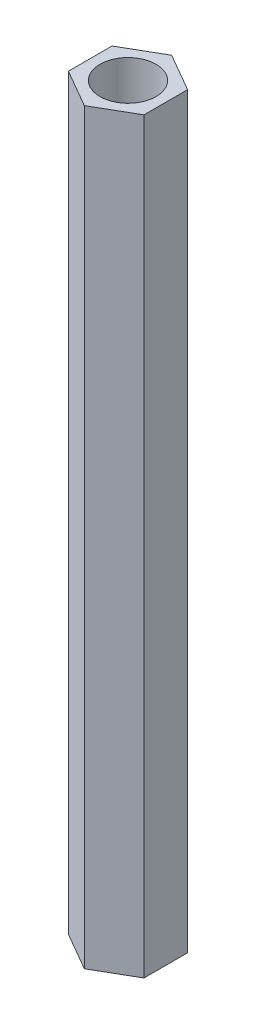
ISO-10303-21;
HEADER;
FILE_DESCRIPTION(('STEP AP214'),'2;1');
FILE_NAME('part.step','',(''),(''),'','','');
FILE_SCHEMA(('AUTOMOTIVE_DESIGN { 1 0 10303 214 1 1 1 1 }'));
ENDSEC;
DATA;
#1=APPLICATION_CONTEXT('core data for automotive mechanical design processes');
#2=APPLICATION_PROTOCOL_DEFINITION('international standard','automotive_design',2000,#1);
#3=PRODUCT_CONTEXT('',#1,'mechanical');
#4=PRODUCT('Part','Part','',(#3));
#5=PRODUCT_RELATED_PRODUCT_CATEGORY('part','',(#4));
#6=PRODUCT_DEFINITION_FORMATION('','',#4);
#7=PRODUCT_DEFINITION_CONTEXT('part definition',#1,'design');
#8=PRODUCT_DEFINITION('design','',#6,#7);
#9=PRODUCT_DEFINITION_SHAPE('','',#8);
#10=(LENGTH_UNIT() NAMED_UNIT(*) SI_UNIT(.MILLI.,.METRE.));
#11=(NAMED_UNIT(*) PLANE_ANGLE_UNIT() SI_UNIT($,.RADIAN.));
#12=(NAMED_UNIT(*) SI_UNIT($,.STERADIAN.) SOLID_ANGLE_UNIT());
#13=UNCERTAINTY_MEASURE_WITH_UNIT(LENGTH_MEASURE(1.E-05),#10,'distance_accuracy_value','');
#14=(GEOMETRIC_REPRESENTATION_CONTEXT(3) GLOBAL_UNCERTAINTY_ASSIGNED_CONTEXT((#13)) GLOBAL_UNIT_ASSIGNED_CONTEXT((#10,
#11,#12)) REPRESENTATION_CONTEXT('',''));
#15=CARTESIAN_POINT('',(0.,0.,0.));
#16=DIRECTION('',(0.,0.,1.));
#17=DIRECTION('',(1.,0.,0.));
#18=AXIS2_PLACEMENT_3D('',#15,#16,#17);
#19=CARTESIAN_POINT('',(0.,40.,0.));
#20=DIRECTION('',(0.,1.,0.));
#21=DIRECTION('',(0.,0.,1.));
#22=AXIS2_PLACEMENT_3D('',#19,#20,#21);
#23=PLANE('',#22);
#24=DIRECTION('',(0.,0.,-1.));
#25=VECTOR('',#24,1.);
#26=CARTESIAN_POINT('',(2.02216931783666,40.,1.1675));
#27=LINE('',#26,#25);
#28=CARTESIAN_POINT('',(2.02216931783666,40.,1.1675));
#29=VERTEX_POINT('',#28);
#30=CARTESIAN_POINT('',(2.02216931783666,40.,-1.1675));
#31=VERTEX_POINT('',#30);
#32=EDGE_CURVE('E137',#29,#31,#27,.T.);
#33=ORIENTED_EDGE('',*,*,#32,.T.);
#34=DIRECTION('',(-0.866025403784439,0.,-0.5));
#35=VECTOR('',#34,1.);
#36=CARTESIAN_POINT('',(2.02216931783666,40.,-1.1675));
#37=LINE('',#36,#35);
#38=CARTESIAN_POINT('',(0.,40.,-2.335));
#39=VERTEX_POINT('',#38);
#40=EDGE_CURVE('E95',#31,#39,#37,.T.);
#41=ORIENTED_EDGE('',*,*,#40,.T.);
#42=DIRECTION('',(-0.866025403784439,0.,0.5));
#43=VECTOR('',#42,1.);
#44=CARTESIAN_POINT('',(0.,40.,-2.335));
#45=LINE('',#44,#43);
#46=CARTESIAN_POINT('',(-2.02216931783666,40.,-1.1675));
#47=VERTEX_POINT('',#46);
#48=EDGE_CURVE('E108',#39,#47,#45,.T.);
#49=ORIENTED_EDGE('',*,*,#48,.T.);
#50=DIRECTION('',(0.,0.,1.));
#51=VECTOR('',#50,1.);
#52=CARTESIAN_POINT('',(-2.02216931783666,40.,-1.1675));
#53=LINE('',#52,#51);
#54=CARTESIAN_POINT('',(-2.02216931783666,40.,1.1675));
#55=VERTEX_POINT('',#54);
#56=EDGE_CURVE('E102',#47,#55,#53,.T.);
#57=ORIENTED_EDGE('',*,*,#56,.T.);
#58=DIRECTION('',(0.866025403784438,0.,0.5));
#59=VECTOR('',#58,1.);
#60=CARTESIAN_POINT('',(-2.02216931783666,40.,1.1675));
#61=LINE('',#60,#59);
#62=CARTESIAN_POINT('',(0.,40.,2.335));
#63=VERTEX_POINT('',#62);
#64=EDGE_CURVE('E106',#55,#63,#61,.T.);
#65=ORIENTED_EDGE('',*,*,#64,.T.);
#66=DIRECTION('',(0.866025403784439,0.,-0.5));
#67=VECTOR('',#66,1.);
#68=CARTESIAN_POINT('',(0.,40.,2.335));
#69=LINE('',#68,#67);
#70=EDGE_CURVE('E58',#63,#29,#69,.T.);
#71=ORIENTED_EDGE('',*,*,#70,.T.);
#72=EDGE_LOOP('',(#33,#41,#49,#57,#65,#71));
#73=FACE_BOUND('',#72,.T.);
#74=CARTESIAN_POINT('',(0.,40.,0.));
#75=DIRECTION('',(0.,1.,0.));
#76=DIRECTION('',(0.,0.,1.));
#77=AXIS2_PLACEMENT_3D('',#74,#75,#76);
#78=CIRCLE('',#77,1.5);
#79=CARTESIAN_POINT('',(0.,40.,1.5));
#80=VERTEX_POINT('',#79);
#81=EDGE_CURVE('E130',#80,#80,#78,.T.);
#82=ORIENTED_EDGE('',*,*,#81,.F.);
#83=EDGE_LOOP('',(#82));
#84=FACE_BOUND('',#83,.T.);
#85=ADVANCED_FACE('F41',(#73,#84),#23,.T.);
#86=CARTESIAN_POINT('',(0.,0.,0.));
#87=DIRECTION('',(0.,1.,0.));
#88=DIRECTION('',(0.,0.,1.));
#89=AXIS2_PLACEMENT_3D('',#86,#87,#88);
#90=PLANE('',#89);
#91=DIRECTION('',(0.,0.,-1.));
#92=VECTOR('',#91,1.);
#93=CARTESIAN_POINT('',(2.02216931783666,0.,1.1675));
#94=LINE('',#93,#92);
#95=CARTESIAN_POINT('',(2.02216931783666,0.,1.1675));
#96=VERTEX_POINT('',#95);
#97=CARTESIAN_POINT('',(2.02216931783666,0.,-1.1675));
#98=VERTEX_POINT('',#97);
#99=EDGE_CURVE('E126',#96,#98,#94,.T.);
#100=ORIENTED_EDGE('',*,*,#99,.F.);
#101=DIRECTION('',(0.866025403784439,0.,-0.5));
#102=VECTOR('',#101,1.);
#103=CARTESIAN_POINT('',(0.,0.,2.335));
#104=LINE('',#103,#102);
#105=CARTESIAN_POINT('',(0.,0.,2.335));
#106=VERTEX_POINT('',#105);
#107=EDGE_CURVE('E87',#106,#96,#104,.T.);
#108=ORIENTED_EDGE('',*,*,#107,.F.);
#109=DIRECTION('',(0.866025403784438,0.,0.5));
#110=VECTOR('',#109,1.);
#111=CARTESIAN_POINT('',(-2.02216931783666,0.,1.1675));
#112=LINE('',#111,#110);
#113=CARTESIAN_POINT('',(-2.02216931783666,0.,1.1675));
#114=VERTEX_POINT('',#113);
#115=EDGE_CURVE('E81',#114,#106,#112,.T.);
#116=ORIENTED_EDGE('',*,*,#115,.F.);
#117=DIRECTION('',(0.,0.,1.));
#118=VECTOR('',#117,1.);
#119=CARTESIAN_POINT('',(-2.02216931783666,0.,-1.1675));
#120=LINE('',#119,#118);
#121=CARTESIAN_POINT('',(-2.02216931783666,0.,-1.1675));
#122=VERTEX_POINT('',#121);
#123=EDGE_CURVE('E116',#122,#114,#120,.T.);
#124=ORIENTED_EDGE('',*,*,#123,.F.);
#125=DIRECTION('',(-0.866025403784439,0.,0.5));
#126=VECTOR('',#125,1.);
#127=CARTESIAN_POINT('',(0.,0.,-2.335));
#128=LINE('',#127,#126);
#129=CARTESIAN_POINT('',(0.,0.,-2.335));
#130=VERTEX_POINT('',#129);
#131=EDGE_CURVE('E132',#130,#122,#128,.T.);
#132=ORIENTED_EDGE('',*,*,#131,.F.);
#133=DIRECTION('',(-0.866025403784439,0.,-0.5));
#134=VECTOR('',#133,1.);
#135=CARTESIAN_POINT('',(2.02216931783666,0.,-1.1675));
#136=LINE('',#135,#134);
#137=EDGE_CURVE('E129',#98,#130,#136,.T.);
#138=ORIENTED_EDGE('',*,*,#137,.F.);
#139=EDGE_LOOP('',(#100,#108,#116,#124,#132,#138));
#140=FACE_BOUND('',#139,.T.);
#141=CARTESIAN_POINT('',(0.,0.,0.));
#142=DIRECTION('',(0.,1.,0.));
#143=DIRECTION('',(0.,0.,1.));
#144=AXIS2_PLACEMENT_3D('',#141,#142,#143);
#145=CIRCLE('',#144,1.5);
#146=CARTESIAN_POINT('',(0.,0.,1.5));
#147=VERTEX_POINT('',#146);
#148=EDGE_CURVE('E230',#147,#147,#145,.T.);
#149=ORIENTED_EDGE('',*,*,#148,.T.);
#150=EDGE_LOOP('',(#149));
#151=FACE_BOUND('',#150,.T.);
#152=ADVANCED_FACE('F146',(#140,#151),#90,.F.);
#153=CARTESIAN_POINT('',(2.02216931783666,40.,1.1675));
#154=DIRECTION('',(-1.,0.,0.));
#155=DIRECTION('',(0.,0.,1.));
#156=AXIS2_PLACEMENT_3D('',#153,#154,#155);
#157=PLANE('',#156);
#158=ORIENTED_EDGE('',*,*,#99,.T.);
#159=DIRECTION('',(0.,-1.,0.));
#160=VECTOR('',#159,1.);
#161=CARTESIAN_POINT('',(2.02216931783666,40.,-1.1675));
#162=LINE('',#161,#160);
#163=EDGE_CURVE('E11',#31,#98,#162,.T.);
#164=ORIENTED_EDGE('',*,*,#163,.F.);
#165=ORIENTED_EDGE('',*,*,#32,.F.);
#166=DIRECTION('',(0.,-1.,0.));
#167=VECTOR('',#166,1.);
#168=CARTESIAN_POINT('',(2.02216931783666,40.,1.1675));
#169=LINE('',#168,#167);
#170=EDGE_CURVE('E122',#29,#96,#169,.T.);
#171=ORIENTED_EDGE('',*,*,#170,.T.);
#172=EDGE_LOOP('',(#158,#164,#165,#171));
#173=FACE_BOUND('',#172,.T.);
#174=ADVANCED_FACE('F43',(#173),#157,.F.);
#175=CARTESIAN_POINT('',(2.02216931783666,40.,-1.1675));
#176=DIRECTION('',(-0.5,0.,0.866025403784438));
#177=DIRECTION('',(0.866025403784439,0.,0.5));
#178=AXIS2_PLACEMENT_3D('',#175,#176,#177);
#179=PLANE('',#178);
#180=ORIENTED_EDGE('',*,*,#137,.T.);
#181=DIRECTION('',(0.,-1.,0.));
#182=VECTOR('',#181,1.);
#183=CARTESIAN_POINT('',(0.,40.,-2.335));
#184=LINE('',#183,#182);
#185=EDGE_CURVE('E50',#39,#130,#184,.T.);
#186=ORIENTED_EDGE('',*,*,#185,.F.);
#187=ORIENTED_EDGE('',*,*,#40,.F.);
#188=ORIENTED_EDGE('',*,*,#163,.T.);
#189=EDGE_LOOP('',(#180,#186,#187,#188));
#190=FACE_BOUND('',#189,.T.);
#191=ADVANCED_FACE('F171',(#190),#179,.F.);
#192=CARTESIAN_POINT('',(0.,40.,-2.335));
#193=DIRECTION('',(0.5,0.,0.866025403784439));
#194=DIRECTION('',(0.866025403784439,0.,-0.5));
#195=AXIS2_PLACEMENT_3D('',#192,#193,#194);
#196=PLANE('',#195);
#197=ORIENTED_EDGE('',*,*,#131,.T.);
#198=DIRECTION('',(0.,-1.,0.));
#199=VECTOR('',#198,1.);
#200=CARTESIAN_POINT('',(-2.02216931783666,40.,-1.1675));
#201=LINE('',#200,#199);
#202=EDGE_CURVE('E117',#47,#122,#201,.T.);
#203=ORIENTED_EDGE('',*,*,#202,.F.);
#204=ORIENTED_EDGE('',*,*,#48,.F.);
#205=ORIENTED_EDGE('',*,*,#185,.T.);
#206=EDGE_LOOP('',(#197,#203,#204,#205));
#207=FACE_BOUND('',#206,.T.);
#208=ADVANCED_FACE('F143',(#207),#196,.F.);
#209=CARTESIAN_POINT('',(-2.02216931783666,40.,-1.1675));
#210=DIRECTION('',(1.,0.,0.));
#211=DIRECTION('',(0.,0.,-1.));
#212=AXIS2_PLACEMENT_3D('',#209,#210,#211);
#213=PLANE('',#212);
#214=ORIENTED_EDGE('',*,*,#123,.T.);
#215=DIRECTION('',(0.,-1.,0.));
#216=VECTOR('',#215,1.);
#217=CARTESIAN_POINT('',(-2.02216931783666,40.,1.1675));
#218=LINE('',#217,#216);
#219=EDGE_CURVE('E113',#55,#114,#218,.T.);
#220=ORIENTED_EDGE('',*,*,#219,.F.);
#221=ORIENTED_EDGE('',*,*,#56,.F.);
#222=ORIENTED_EDGE('',*,*,#202,.T.);
#223=EDGE_LOOP('',(#214,#220,#221,#222));
#224=FACE_BOUND('',#223,.T.);
#225=ADVANCED_FACE('F114',(#224),#213,.F.);
#226=CARTESIAN_POINT('',(-2.02216931783666,40.,1.1675));
#227=DIRECTION('',(0.5,0.,-0.866025403784438));
#228=DIRECTION('',(-0.866025403784438,0.,-0.5));
#229=AXIS2_PLACEMENT_3D('',#226,#227,#228);
#230=PLANE('',#229);
#231=ORIENTED_EDGE('',*,*,#115,.T.);
#232=DIRECTION('',(0.,-1.,0.));
#233=VECTOR('',#232,1.);
#234=CARTESIAN_POINT('',(0.,40.,2.335));
#235=LINE('',#234,#233);
#236=EDGE_CURVE('E118',#63,#106,#235,.T.);
#237=ORIENTED_EDGE('',*,*,#236,.F.);
#238=ORIENTED_EDGE('',*,*,#64,.F.);
#239=ORIENTED_EDGE('',*,*,#219,.T.);
#240=EDGE_LOOP('',(#231,#237,#238,#239));
#241=FACE_BOUND('',#240,.T.);
#242=ADVANCED_FACE('F120',(#241),#230,.F.);
#243=CARTESIAN_POINT('',(0.,40.,2.335));
#244=DIRECTION('',(-0.5,0.,-0.866025403784439));
#245=DIRECTION('',(-0.866025403784439,0.,0.5));
#246=AXIS2_PLACEMENT_3D('',#243,#244,#245);
#247=PLANE('',#246);
#248=ORIENTED_EDGE('',*,*,#107,.T.);
#249=ORIENTED_EDGE('',*,*,#170,.F.);
#250=ORIENTED_EDGE('',*,*,#70,.F.);
#251=ORIENTED_EDGE('',*,*,#236,.T.);
#252=EDGE_LOOP('',(#248,#249,#250,#251));
#253=FACE_BOUND('',#252,.T.);
#254=ADVANCED_FACE('F151',(#253),#247,.F.);
#255=CARTESIAN_POINT('',(0.,40.,0.));
#256=DIRECTION('',(0.,-1.,0.));
#257=DIRECTION('',(0.,0.,-1.));
#258=AXIS2_PLACEMENT_3D('',#255,#256,#257);
#259=CYLINDRICAL_SURFACE('',#258,1.5);
#260=ORIENTED_EDGE('',*,*,#81,.T.);
#261=EDGE_LOOP('',(#260));
#262=FACE_BOUND('',#261,.T.);
#263=ORIENTED_EDGE('',*,*,#148,.F.);
#264=EDGE_LOOP('',(#263));
#265=FACE_BOUND('',#264,.T.);
#266=ADVANCED_FACE('F153',(#262,#265),#259,.F.);
#267=CLOSED_SHELL('',(#85,#152,#174,#191,#208,#225,#242,#254,#266));
#268=MANIFOLD_SOLID_BREP('B2',#267);
#269=ADVANCED_BREP_SHAPE_REPRESENTATION('',(#18,#268),#14);
#270=SHAPE_DEFINITION_REPRESENTATION(#9,#269);
ENDSEC;
END-ISO-10303-21;
